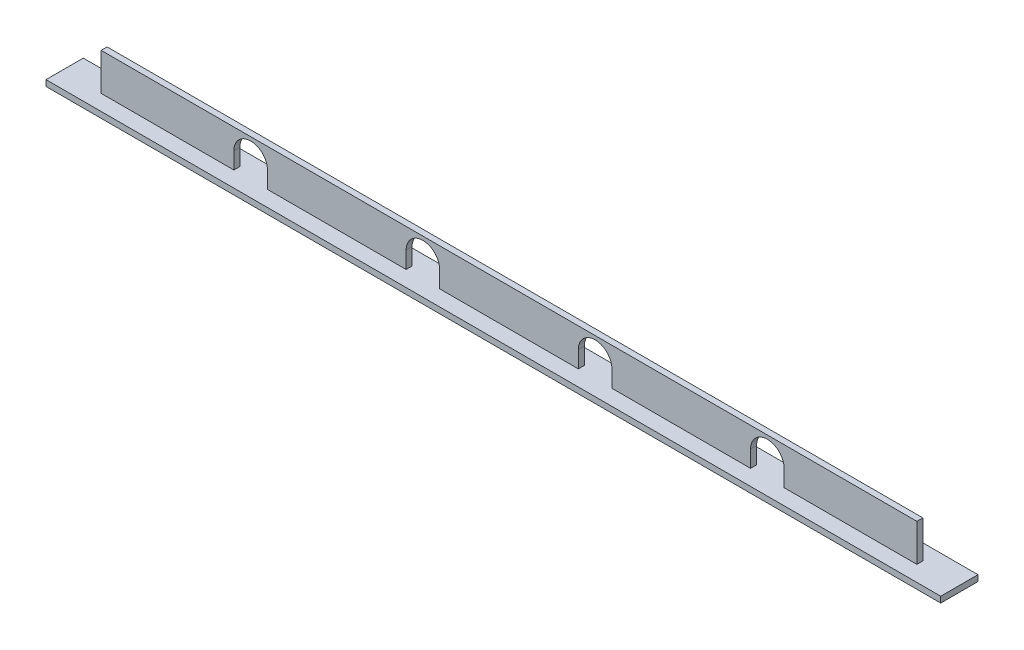
ISO-10303-21;
HEADER;
FILE_DESCRIPTION(('STEP AP214'),'2;1');
FILE_NAME('part.step','',(''),(''),'','','');
FILE_SCHEMA(('AUTOMOTIVE_DESIGN { 1 0 10303 214 1 1 1 1 }'));
ENDSEC;
DATA;
#1=APPLICATION_CONTEXT('core data for automotive mechanical design processes');
#2=APPLICATION_PROTOCOL_DEFINITION('international standard','automotive_design',2000,#1);
#3=PRODUCT_CONTEXT('',#1,'mechanical');
#4=PRODUCT('Part','Part','',(#3));
#5=PRODUCT_RELATED_PRODUCT_CATEGORY('part','',(#4));
#6=PRODUCT_DEFINITION_FORMATION('','',#4);
#7=PRODUCT_DEFINITION_CONTEXT('part definition',#1,'design');
#8=PRODUCT_DEFINITION('design','',#6,#7);
#9=PRODUCT_DEFINITION_SHAPE('','',#8);
#10=(LENGTH_UNIT() NAMED_UNIT(*) SI_UNIT(.MILLI.,.METRE.));
#11=(NAMED_UNIT(*) PLANE_ANGLE_UNIT() SI_UNIT($,.RADIAN.));
#12=(NAMED_UNIT(*) SI_UNIT($,.STERADIAN.) SOLID_ANGLE_UNIT());
#13=UNCERTAINTY_MEASURE_WITH_UNIT(LENGTH_MEASURE(1.E-05),#10,'distance_accuracy_value','');
#14=(GEOMETRIC_REPRESENTATION_CONTEXT(3) GLOBAL_UNCERTAINTY_ASSIGNED_CONTEXT((#13)) GLOBAL_UNIT_ASSIGNED_CONTEXT((#10,
#11,#12)) REPRESENTATION_CONTEXT('',''));
#15=CARTESIAN_POINT('',(0.,0.,0.));
#16=DIRECTION('',(0.,0.,1.));
#17=DIRECTION('',(1.,0.,0.));
#18=AXIS2_PLACEMENT_3D('',#15,#16,#17);
#19=CARTESIAN_POINT('',(600.,-33.,-24.9999999999999));
#20=DIRECTION('',(-1.,0.,0.));
#21=DIRECTION('',(0.,0.,1.));
#22=AXIS2_PLACEMENT_3D('',#19,#20,#21);
#23=PLANE('',#22);
#24=DIRECTION('',(0.,0.,1.));
#25=VECTOR('',#24,1.);
#26=CARTESIAN_POINT('',(600.,-25.,-24.9999999999999));
#27=LINE('',#26,#25);
#28=CARTESIAN_POINT('',(600.,-25.,-24.9999999999999));
#29=VERTEX_POINT('',#28);
#30=CARTESIAN_POINT('',(600.,-25.,24.9999999999999));
#31=VERTEX_POINT('',#30);
#32=EDGE_CURVE('E111',#29,#31,#27,.T.);
#33=ORIENTED_EDGE('',*,*,#32,.T.);
#34=DIRECTION('',(0.,1.,0.));
#35=VECTOR('',#34,1.);
#36=CARTESIAN_POINT('',(600.,-33.,24.9999999999999));
#37=LINE('',#36,#35);
#38=CARTESIAN_POINT('',(600.,-33.,24.9999999999999));
#39=VERTEX_POINT('',#38);
#40=EDGE_CURVE('E13',#39,#31,#37,.T.);
#41=ORIENTED_EDGE('',*,*,#40,.F.);
#42=DIRECTION('',(0.,0.,1.));
#43=VECTOR('',#42,1.);
#44=CARTESIAN_POINT('',(600.,-33.,-24.9999999999999));
#45=LINE('',#44,#43);
#46=CARTESIAN_POINT('',(600.,-33.,-24.9999999999999));
#47=VERTEX_POINT('',#46);
#48=EDGE_CURVE('E99',#47,#39,#45,.T.);
#49=ORIENTED_EDGE('',*,*,#48,.F.);
#50=DIRECTION('',(0.,1.,0.));
#51=VECTOR('',#50,1.);
#52=CARTESIAN_POINT('',(600.,-33.,-24.9999999999999));
#53=LINE('',#52,#51);
#54=EDGE_CURVE('E107',#47,#29,#53,.T.);
#55=ORIENTED_EDGE('',*,*,#54,.T.);
#56=EDGE_LOOP('',(#33,#41,#49,#55));
#57=FACE_BOUND('',#56,.T.);
#58=ADVANCED_FACE('F48',(#57),#23,.F.);
#59=CARTESIAN_POINT('',(-600.,-33.,24.9999999999997));
#60=DIRECTION('',(0.,0.,-1.));
#61=DIRECTION('',(-1.,0.,0.));
#62=AXIS2_PLACEMENT_3D('',#59,#60,#61);
#63=PLANE('',#62);
#64=DIRECTION('',(-1.,0.,0.));
#65=VECTOR('',#64,1.);
#66=CARTESIAN_POINT('',(-600.,-25.,24.9999999999997));
#67=LINE('',#66,#65);
#68=CARTESIAN_POINT('',(-600.,-25.,24.9999999999997));
#69=VERTEX_POINT('',#68);
#70=EDGE_CURVE('E103',#31,#69,#67,.T.);
#71=ORIENTED_EDGE('',*,*,#70,.T.);
#72=DIRECTION('',(0.,1.,0.));
#73=VECTOR('',#72,1.);
#74=CARTESIAN_POINT('',(-600.,-33.,24.9999999999997));
#75=LINE('',#74,#73);
#76=CARTESIAN_POINT('',(-600.,-33.,24.9999999999997));
#77=VERTEX_POINT('',#76);
#78=EDGE_CURVE('E56',#77,#69,#75,.T.);
#79=ORIENTED_EDGE('',*,*,#78,.F.);
#80=DIRECTION('',(-1.,0.,0.));
#81=VECTOR('',#80,1.);
#82=CARTESIAN_POINT('',(-600.,-33.,24.9999999999997));
#83=LINE('',#82,#81);
#84=EDGE_CURVE('E94',#39,#77,#83,.T.);
#85=ORIENTED_EDGE('',*,*,#84,.F.);
#86=ORIENTED_EDGE('',*,*,#40,.T.);
#87=EDGE_LOOP('',(#71,#79,#85,#86));
#88=FACE_BOUND('',#87,.T.);
#89=ADVANCED_FACE('F102',(#88),#63,.F.);
#90=CARTESIAN_POINT('',(-600.,-33.,-25.));
#91=DIRECTION('',(1.,0.,0.));
#92=DIRECTION('',(0.,0.,-1.));
#93=AXIS2_PLACEMENT_3D('',#90,#91,#92);
#94=PLANE('',#93);
#95=DIRECTION('',(0.,0.,-1.));
#96=VECTOR('',#95,1.);
#97=CARTESIAN_POINT('',(-600.,-25.,-25.));
#98=LINE('',#97,#96);
#99=CARTESIAN_POINT('',(-600.,-25.,-25.));
#100=VERTEX_POINT('',#99);
#101=EDGE_CURVE('E81',#69,#100,#98,.T.);
#102=ORIENTED_EDGE('',*,*,#101,.T.);
#103=DIRECTION('',(0.,1.,0.));
#104=VECTOR('',#103,1.);
#105=CARTESIAN_POINT('',(-600.,-33.,-25.));
#106=LINE('',#105,#104);
#107=CARTESIAN_POINT('',(-600.,-33.,-25.));
#108=VERTEX_POINT('',#107);
#109=EDGE_CURVE('E104',#108,#100,#106,.T.);
#110=ORIENTED_EDGE('',*,*,#109,.F.);
#111=DIRECTION('',(0.,0.,-1.));
#112=VECTOR('',#111,1.);
#113=CARTESIAN_POINT('',(-600.,-33.,-25.));
#114=LINE('',#113,#112);
#115=EDGE_CURVE('E97',#77,#108,#114,.T.);
#116=ORIENTED_EDGE('',*,*,#115,.F.);
#117=ORIENTED_EDGE('',*,*,#78,.T.);
#118=EDGE_LOOP('',(#102,#110,#116,#117));
#119=FACE_BOUND('',#118,.T.);
#120=ADVANCED_FACE('F105',(#119),#94,.F.);
#121=CARTESIAN_POINT('',(-600.,-33.,-25.));
#122=DIRECTION('',(0.,0.,1.));
#123=DIRECTION('',(1.,0.,0.));
#124=AXIS2_PLACEMENT_3D('',#121,#122,#123);
#125=PLANE('',#124);
#126=DIRECTION('',(1.,0.,0.));
#127=VECTOR('',#126,1.);
#128=CARTESIAN_POINT('',(-600.,-25.,-25.));
#129=LINE('',#128,#127);
#130=EDGE_CURVE('E87',#100,#29,#129,.T.);
#131=ORIENTED_EDGE('',*,*,#130,.T.);
#132=ORIENTED_EDGE('',*,*,#54,.F.);
#133=DIRECTION('',(1.,0.,0.));
#134=VECTOR('',#133,1.);
#135=CARTESIAN_POINT('',(-600.,-33.,-25.));
#136=LINE('',#135,#134);
#137=EDGE_CURVE('E64',#108,#47,#136,.T.);
#138=ORIENTED_EDGE('',*,*,#137,.F.);
#139=ORIENTED_EDGE('',*,*,#109,.T.);
#140=EDGE_LOOP('',(#131,#132,#138,#139));
#141=FACE_BOUND('',#140,.T.);
#142=ADVANCED_FACE('F118',(#141),#125,.F.);
#143=CARTESIAN_POINT('',(0.,-33.,0.));
#144=DIRECTION('',(0.,1.,0.));
#145=DIRECTION('',(0.,0.,1.));
#146=AXIS2_PLACEMENT_3D('',#143,#144,#145);
#147=PLANE('',#146);
#148=ORIENTED_EDGE('',*,*,#48,.T.);
#149=ORIENTED_EDGE('',*,*,#84,.T.);
#150=ORIENTED_EDGE('',*,*,#115,.T.);
#151=ORIENTED_EDGE('',*,*,#137,.T.);
#152=EDGE_LOOP('',(#148,#149,#150,#151));
#153=FACE_BOUND('',#152,.T.);
#154=ADVANCED_FACE('F95',(#153),#147,.F.);
#155=CARTESIAN_POINT('',(0.,-25.,0.));
#156=DIRECTION('',(0.,1.,0.));
#157=DIRECTION('',(0.,0.,1.));
#158=AXIS2_PLACEMENT_3D('',#155,#156,#157);
#159=PLANE('',#158);
#160=ORIENTED_EDGE('',*,*,#32,.F.);
#161=ORIENTED_EDGE('',*,*,#130,.F.);
#162=ORIENTED_EDGE('',*,*,#101,.F.);
#163=ORIENTED_EDGE('',*,*,#70,.F.);
#164=EDGE_LOOP('',(#160,#161,#162,#163));
#165=FACE_BOUND('',#164,.T.);
#166=ADVANCED_FACE('F121',(#165),#159,.T.);
#167=CLOSED_SHELL('',(#58,#89,#120,#142,#154,#166));
#168=MANIFOLD_SOLID_BREP('B2',#167);
#169=CARTESIAN_POINT('',(-605.,24.9999999999997,4.));
#170=DIRECTION('',(0.,-1.,0.));
#171=DIRECTION('',(1.,0.,0.));
#172=AXIS2_PLACEMENT_3D('',#169,#170,#171);
#173=PLANE('',#172);
#174=DIRECTION('',(0.,0.,-1.));
#175=VECTOR('',#174,1.);
#176=CARTESIAN_POINT('',(547.,24.9999999999998,3.99999999999993));
#177=LINE('',#176,#175);
#178=CARTESIAN_POINT('',(547.,24.9999999999998,3.99999999999993));
#179=VERTEX_POINT('',#178);
#180=CARTESIAN_POINT('',(547.,24.9999999999998,-4.00000000000021));
#181=VERTEX_POINT('',#180);
#182=EDGE_CURVE('E484',#179,#181,#177,.T.);
#183=ORIENTED_EDGE('',*,*,#182,.T.);
#184=DIRECTION('',(-1.,0.,0.));
#185=VECTOR('',#184,1.);
#186=CARTESIAN_POINT('',(-605.,24.9999999999997,-4.));
#187=LINE('',#186,#185);
#188=CARTESIAN_POINT('',(-547.,24.9999999999997,-4.));
#189=VERTEX_POINT('',#188);
#190=EDGE_CURVE('E367',#181,#189,#187,.T.);
#191=ORIENTED_EDGE('',*,*,#190,.T.);
#192=DIRECTION('',(0.,0.,1.));
#193=VECTOR('',#192,1.);
#194=CARTESIAN_POINT('',(-547.,24.9999999999997,-4.00000000000021));
#195=LINE('',#194,#193);
#196=CARTESIAN_POINT('',(-547.,24.9999999999997,3.99999999999999));
#197=VERTEX_POINT('',#196);
#198=EDGE_CURVE('E186',#189,#197,#195,.T.);
#199=ORIENTED_EDGE('',*,*,#198,.T.);
#200=DIRECTION('',(-1.,0.,0.));
#201=VECTOR('',#200,1.);
#202=CARTESIAN_POINT('',(-605.,24.9999999999997,4.));
#203=LINE('',#202,#201);
#204=EDGE_CURVE('E324',#179,#197,#203,.T.);
#205=ORIENTED_EDGE('',*,*,#204,.F.);
#206=EDGE_LOOP('',(#183,#191,#199,#205));
#207=FACE_BOUND('',#206,.T.);
#208=ADVANCED_FACE('F172',(#207),#173,.F.);
#209=CARTESIAN_POINT('',(-555.,-25.,4.));
#210=DIRECTION('',(0.,1.,0.));
#211=DIRECTION('',(0.,0.,1.));
#212=AXIS2_PLACEMENT_3D('',#209,#210,#211);
#213=PLANE('',#212);
#214=DIRECTION('',(0.,0.,1.));
#215=VECTOR('',#214,1.);
#216=CARTESIAN_POINT('',(-547.,-25.0000000000001,-4.00000000000021));
#217=LINE('',#216,#215);
#218=CARTESIAN_POINT('',(-547.,-25.0000000000001,-4.00000000000021));
#219=VERTEX_POINT('',#218);
#220=CARTESIAN_POINT('',(-547.,-25.0000000000001,3.99999999999999));
#221=VERTEX_POINT('',#220);
#222=EDGE_CURVE('E306',#219,#221,#217,.T.);
#223=ORIENTED_EDGE('',*,*,#222,.F.);
#224=DIRECTION('',(1.,0.,0.));
#225=VECTOR('',#224,1.);
#226=CARTESIAN_POINT('',(-555.,-25.,-4.));
#227=LINE('',#226,#225);
#228=CARTESIAN_POINT('',(-369.,-25.,-4.));
#229=VERTEX_POINT('',#228);
#230=EDGE_CURVE('E370',#219,#229,#227,.T.);
#231=ORIENTED_EDGE('',*,*,#230,.T.);
#232=DIRECTION('',(0.,0.,-1.));
#233=VECTOR('',#232,1.);
#234=CARTESIAN_POINT('',(-369.,-25.,4.));
#235=LINE('',#234,#233);
#236=CARTESIAN_POINT('',(-369.,-25.,4.));
#237=VERTEX_POINT('',#236);
#238=EDGE_CURVE('E46',#237,#229,#235,.T.);
#239=ORIENTED_EDGE('',*,*,#238,.F.);
#240=DIRECTION('',(1.,0.,0.));
#241=VECTOR('',#240,1.);
#242=CARTESIAN_POINT('',(-555.,-25.,4.));
#243=LINE('',#242,#241);
#244=EDGE_CURVE('E320',#221,#237,#243,.T.);
#245=ORIENTED_EDGE('',*,*,#244,.F.);
#246=EDGE_LOOP('',(#223,#231,#239,#245));
#247=FACE_BOUND('',#246,.T.);
#248=ADVANCED_FACE('F327',(#247),#213,.F.);
#249=CARTESIAN_POINT('',(369.,-25.,4.));
#250=DIRECTION('',(0.,1.,0.));
#251=DIRECTION('',(0.,0.,1.));
#252=AXIS2_PLACEMENT_3D('',#249,#250,#251);
#253=PLANE('',#252);
#254=DIRECTION('',(0.,0.,-1.));
#255=VECTOR('',#254,1.);
#256=CARTESIAN_POINT('',(547.,-25.,3.99999999999993));
#257=LINE('',#256,#255);
#258=CARTESIAN_POINT('',(547.,-25.,3.99999999999993));
#259=VERTEX_POINT('',#258);
#260=CARTESIAN_POINT('',(547.,-25.,-4.));
#261=VERTEX_POINT('',#260);
#262=EDGE_CURVE('E194',#259,#261,#257,.T.);
#263=ORIENTED_EDGE('',*,*,#262,.F.);
#264=DIRECTION('',(1.,0.,0.));
#265=VECTOR('',#264,1.);
#266=CARTESIAN_POINT('',(369.,-25.,4.));
#267=LINE('',#266,#265);
#268=CARTESIAN_POINT('',(369.,-25.,4.));
#269=VERTEX_POINT('',#268);
#270=EDGE_CURVE('E364',#269,#259,#267,.T.);
#271=ORIENTED_EDGE('',*,*,#270,.F.);
#272=DIRECTION('',(0.,0.,-1.));
#273=VECTOR('',#272,1.);
#274=CARTESIAN_POINT('',(369.,-25.,4.));
#275=LINE('',#274,#273);
#276=CARTESIAN_POINT('',(369.,-25.,-4.));
#277=VERTEX_POINT('',#276);
#278=EDGE_CURVE('E366',#269,#277,#275,.T.);
#279=ORIENTED_EDGE('',*,*,#278,.T.);
#280=DIRECTION('',(1.,0.,0.));
#281=VECTOR('',#280,1.);
#282=CARTESIAN_POINT('',(369.,-25.,-4.));
#283=LINE('',#282,#281);
#284=EDGE_CURVE('E333',#277,#261,#283,.T.);
#285=ORIENTED_EDGE('',*,*,#284,.T.);
#286=EDGE_LOOP('',(#263,#271,#279,#285));
#287=FACE_BOUND('',#286,.T.);
#288=ADVANCED_FACE('F482',(#287),#253,.F.);
#289=CARTESIAN_POINT('',(-577.5,-2.49999999999998,4.));
#290=DIRECTION('',(0.,0.,1.));
#291=DIRECTION('',(1.,0.,0.));
#292=AXIS2_PLACEMENT_3D('',#289,#290,#291);
#293=PLANE('',#292);
#294=ORIENTED_EDGE('',*,*,#270,.T.);
#295=DIRECTION('',(0.,1.,0.));
#296=VECTOR('',#295,1.);
#297=CARTESIAN_POINT('',(547.,-25.,3.99999999999993));
#298=LINE('',#297,#296);
#299=EDGE_CURVE('E325',#259,#179,#298,.T.);
#300=ORIENTED_EDGE('',*,*,#299,.T.);
#301=ORIENTED_EDGE('',*,*,#204,.T.);
#302=DIRECTION('',(0.,1.,0.));
#303=VECTOR('',#302,1.);
#304=CARTESIAN_POINT('',(-547.,-25.0000000000001,3.99999999999999));
#305=LINE('',#304,#303);
#306=EDGE_CURVE('E309',#221,#197,#305,.T.);
#307=ORIENTED_EDGE('',*,*,#306,.F.);
#308=ORIENTED_EDGE('',*,*,#244,.T.);
#309=DIRECTION('',(0.,1.,0.));
#310=VECTOR('',#309,1.);
#311=CARTESIAN_POINT('',(-369.,-2.49999999999998,4.));
#312=LINE('',#311,#310);
#313=CARTESIAN_POINT('',(-369.,-2.49999999999998,4.));
#314=VERTEX_POINT('',#313);
#315=EDGE_CURVE('E329',#237,#314,#312,.T.);
#316=ORIENTED_EDGE('',*,*,#315,.T.);
#317=CARTESIAN_POINT('',(-346.5,-2.49999999999998,4.));
#318=DIRECTION('',(0.,0.,-1.));
#319=DIRECTION('',(1.,0.,0.));
#320=AXIS2_PLACEMENT_3D('',#317,#318,#319);
#321=CIRCLE('',#320,22.5);
#322=CARTESIAN_POINT('',(-324.,-2.49999999999998,4.));
#323=VERTEX_POINT('',#322);
#324=EDGE_CURVE('E331',#314,#323,#321,.T.);
#325=ORIENTED_EDGE('',*,*,#324,.T.);
#326=DIRECTION('',(0.,-1.,0.));
#327=VECTOR('',#326,1.);
#328=CARTESIAN_POINT('',(-324.,-2.49999999999998,4.));
#329=LINE('',#328,#327);
#330=CARTESIAN_POINT('',(-324.,-25.,4.));
#331=VERTEX_POINT('',#330);
#332=EDGE_CURVE('E338',#323,#331,#329,.T.);
#333=ORIENTED_EDGE('',*,*,#332,.T.);
#334=DIRECTION('',(1.,0.,0.));
#335=VECTOR('',#334,1.);
#336=CARTESIAN_POINT('',(-324.,-25.,4.));
#337=LINE('',#336,#335);
#338=CARTESIAN_POINT('',(-138.,-25.,4.));
#339=VERTEX_POINT('',#338);
#340=EDGE_CURVE('E340',#331,#339,#337,.T.);
#341=ORIENTED_EDGE('',*,*,#340,.T.);
#342=DIRECTION('',(0.,1.,0.));
#343=VECTOR('',#342,1.);
#344=CARTESIAN_POINT('',(-138.,-2.49999999999998,4.));
#345=LINE('',#344,#343);
#346=CARTESIAN_POINT('',(-138.,-2.49999999999998,4.));
#347=VERTEX_POINT('',#346);
#348=EDGE_CURVE('E342',#339,#347,#345,.T.);
#349=ORIENTED_EDGE('',*,*,#348,.T.);
#350=CARTESIAN_POINT('',(-115.5,-2.49999999999998,4.));
#351=DIRECTION('',(0.,0.,-1.));
#352=DIRECTION('',(1.,0.,0.));
#353=AXIS2_PLACEMENT_3D('',#350,#351,#352);
#354=CIRCLE('',#353,22.5);
#355=CARTESIAN_POINT('',(-92.9999999999999,-2.49999999999998,4.));
#356=VERTEX_POINT('',#355);
#357=EDGE_CURVE('E344',#347,#356,#354,.T.);
#358=ORIENTED_EDGE('',*,*,#357,.T.);
#359=DIRECTION('',(0.,-1.,0.));
#360=VECTOR('',#359,1.);
#361=CARTESIAN_POINT('',(-93.,-2.49999999999998,4.));
#362=LINE('',#361,#360);
#363=CARTESIAN_POINT('',(-93.,-25.,4.));
#364=VERTEX_POINT('',#363);
#365=EDGE_CURVE('E346',#356,#364,#362,.T.);
#366=ORIENTED_EDGE('',*,*,#365,.T.);
#367=DIRECTION('',(1.,0.,0.));
#368=VECTOR('',#367,1.);
#369=CARTESIAN_POINT('',(-93.,-25.,4.));
#370=LINE('',#369,#368);
#371=CARTESIAN_POINT('',(93.,-25.,4.));
#372=VERTEX_POINT('',#371);
#373=EDGE_CURVE('E348',#364,#372,#370,.T.);
#374=ORIENTED_EDGE('',*,*,#373,.T.);
#375=DIRECTION('',(0.,1.,0.));
#376=VECTOR('',#375,1.);
#377=CARTESIAN_POINT('',(93.,-2.49999999999998,4.));
#378=LINE('',#377,#376);
#379=CARTESIAN_POINT('',(93.,-2.49999999999998,4.));
#380=VERTEX_POINT('',#379);
#381=EDGE_CURVE('E350',#372,#380,#378,.T.);
#382=ORIENTED_EDGE('',*,*,#381,.T.);
#383=CARTESIAN_POINT('',(115.5,-2.49999999999998,4.));
#384=DIRECTION('',(0.,0.,-1.));
#385=DIRECTION('',(1.,0.,0.));
#386=AXIS2_PLACEMENT_3D('',#383,#384,#385);
#387=CIRCLE('',#386,22.5);
#388=CARTESIAN_POINT('',(138.,-2.49999999999998,4.));
#389=VERTEX_POINT('',#388);
#390=EDGE_CURVE('E352',#380,#389,#387,.T.);
#391=ORIENTED_EDGE('',*,*,#390,.T.);
#392=DIRECTION('',(0.,-1.,0.));
#393=VECTOR('',#392,1.);
#394=CARTESIAN_POINT('',(138.,-2.49999999999998,4.));
#395=LINE('',#394,#393);
#396=CARTESIAN_POINT('',(138.,-25.,4.));
#397=VERTEX_POINT('',#396);
#398=EDGE_CURVE('E354',#389,#397,#395,.T.);
#399=ORIENTED_EDGE('',*,*,#398,.T.);
#400=DIRECTION('',(1.,0.,0.));
#401=VECTOR('',#400,1.);
#402=CARTESIAN_POINT('',(138.,-25.,4.));
#403=LINE('',#402,#401);
#404=CARTESIAN_POINT('',(324.,-25.,4.));
#405=VERTEX_POINT('',#404);
#406=EDGE_CURVE('E356',#397,#405,#403,.T.);
#407=ORIENTED_EDGE('',*,*,#406,.T.);
#408=DIRECTION('',(0.,1.,0.));
#409=VECTOR('',#408,1.);
#410=CARTESIAN_POINT('',(324.,-2.49999999999998,4.));
#411=LINE('',#410,#409);
#412=CARTESIAN_POINT('',(324.,-2.49999999999998,4.));
#413=VERTEX_POINT('',#412);
#414=EDGE_CURVE('E358',#405,#413,#411,.T.);
#415=ORIENTED_EDGE('',*,*,#414,.T.);
#416=CARTESIAN_POINT('',(346.5,-2.49999999999998,4.));
#417=DIRECTION('',(0.,0.,-1.));
#418=DIRECTION('',(1.,0.,0.));
#419=AXIS2_PLACEMENT_3D('',#416,#417,#418);
#420=CIRCLE('',#419,22.5);
#421=CARTESIAN_POINT('',(369.,-2.49999999999998,4.));
#422=VERTEX_POINT('',#421);
#423=EDGE_CURVE('E360',#413,#422,#420,.T.);
#424=ORIENTED_EDGE('',*,*,#423,.T.);
#425=DIRECTION('',(0.,-1.,0.));
#426=VECTOR('',#425,1.);
#427=CARTESIAN_POINT('',(369.,-2.49999999999998,4.));
#428=LINE('',#427,#426);
#429=EDGE_CURVE('E362',#422,#269,#428,.T.);
#430=ORIENTED_EDGE('',*,*,#429,.T.);
#431=EDGE_LOOP('',(#294,#300,#301,#307,#308,#316,#325,#333,#341,#349,#358,#366,#374,#382,#391,
#399,#407,#415,#424,#430));
#432=FACE_BOUND('',#431,.T.);
#433=ADVANCED_FACE('F319',(#432),#293,.T.);
#434=CARTESIAN_POINT('',(-577.5,-2.49999999999998,-4.));
#435=DIRECTION('',(0.,0.,1.));
#436=DIRECTION('',(1.,0.,0.));
#437=AXIS2_PLACEMENT_3D('',#434,#435,#436);
#438=PLANE('',#437);
#439=DIRECTION('',(0.,1.,0.));
#440=VECTOR('',#439,1.);
#441=CARTESIAN_POINT('',(547.,-25.,-4.00000000000021));
#442=LINE('',#441,#440);
#443=EDGE_CURVE('E314',#261,#181,#442,.T.);
#444=ORIENTED_EDGE('',*,*,#443,.F.);
#445=ORIENTED_EDGE('',*,*,#284,.F.);
#446=DIRECTION('',(0.,-1.,0.));
#447=VECTOR('',#446,1.);
#448=CARTESIAN_POINT('',(369.,-2.49999999999998,-4.));
#449=LINE('',#448,#447);
#450=CARTESIAN_POINT('',(369.,-2.49999999999998,-4.));
#451=VERTEX_POINT('',#450);
#452=EDGE_CURVE('E400',#451,#277,#449,.T.);
#453=ORIENTED_EDGE('',*,*,#452,.F.);
#454=CARTESIAN_POINT('',(346.5,-2.49999999999998,-4.));
#455=DIRECTION('',(0.,0.,-1.));
#456=DIRECTION('',(1.,0.,0.));
#457=AXIS2_PLACEMENT_3D('',#454,#455,#456);
#458=CIRCLE('',#457,22.5);
#459=CARTESIAN_POINT('',(324.,-2.49999999999998,-4.));
#460=VERTEX_POINT('',#459);
#461=EDGE_CURVE('E398',#460,#451,#458,.T.);
#462=ORIENTED_EDGE('',*,*,#461,.F.);
#463=DIRECTION('',(0.,1.,0.));
#464=VECTOR('',#463,1.);
#465=CARTESIAN_POINT('',(324.,-2.49999999999998,-4.));
#466=LINE('',#465,#464);
#467=CARTESIAN_POINT('',(324.,-25.,-4.));
#468=VERTEX_POINT('',#467);
#469=EDGE_CURVE('E396',#468,#460,#466,.T.);
#470=ORIENTED_EDGE('',*,*,#469,.F.);
#471=DIRECTION('',(1.,0.,0.));
#472=VECTOR('',#471,1.);
#473=CARTESIAN_POINT('',(138.,-25.,-4.));
#474=LINE('',#473,#472);
#475=CARTESIAN_POINT('',(138.,-25.,-4.));
#476=VERTEX_POINT('',#475);
#477=EDGE_CURVE('E394',#476,#468,#474,.T.);
#478=ORIENTED_EDGE('',*,*,#477,.F.);
#479=DIRECTION('',(0.,-1.,0.));
#480=VECTOR('',#479,1.);
#481=CARTESIAN_POINT('',(138.,-2.49999999999998,-4.));
#482=LINE('',#481,#480);
#483=CARTESIAN_POINT('',(138.,-2.49999999999998,-4.));
#484=VERTEX_POINT('',#483);
#485=EDGE_CURVE('E392',#484,#476,#482,.T.);
#486=ORIENTED_EDGE('',*,*,#485,.F.);
#487=CARTESIAN_POINT('',(115.5,-2.49999999999998,-4.));
#488=DIRECTION('',(0.,0.,-1.));
#489=DIRECTION('',(1.,0.,0.));
#490=AXIS2_PLACEMENT_3D('',#487,#488,#489);
#491=CIRCLE('',#490,22.5);
#492=CARTESIAN_POINT('',(93.,-2.49999999999998,-4.));
#493=VERTEX_POINT('',#492);
#494=EDGE_CURVE('E390',#493,#484,#491,.T.);
#495=ORIENTED_EDGE('',*,*,#494,.F.);
#496=DIRECTION('',(0.,1.,0.));
#497=VECTOR('',#496,1.);
#498=CARTESIAN_POINT('',(93.,-2.49999999999998,-4.));
#499=LINE('',#498,#497);
#500=CARTESIAN_POINT('',(93.,-25.,-4.));
#501=VERTEX_POINT('',#500);
#502=EDGE_CURVE('E388',#501,#493,#499,.T.);
#503=ORIENTED_EDGE('',*,*,#502,.F.);
#504=DIRECTION('',(1.,0.,0.));
#505=VECTOR('',#504,1.);
#506=CARTESIAN_POINT('',(-93.,-25.,-4.));
#507=LINE('',#506,#505);
#508=CARTESIAN_POINT('',(-93.,-25.,-4.));
#509=VERTEX_POINT('',#508);
#510=EDGE_CURVE('E386',#509,#501,#507,.T.);
#511=ORIENTED_EDGE('',*,*,#510,.F.);
#512=DIRECTION('',(0.,-1.,0.));
#513=VECTOR('',#512,1.);
#514=CARTESIAN_POINT('',(-93.,-2.49999999999998,-4.));
#515=LINE('',#514,#513);
#516=CARTESIAN_POINT('',(-92.9999999999999,-2.49999999999998,-4.));
#517=VERTEX_POINT('',#516);
#518=EDGE_CURVE('E384',#517,#509,#515,.T.);
#519=ORIENTED_EDGE('',*,*,#518,.F.);
#520=CARTESIAN_POINT('',(-115.5,-2.49999999999998,-4.));
#521=DIRECTION('',(0.,0.,-1.));
#522=DIRECTION('',(1.,0.,0.));
#523=AXIS2_PLACEMENT_3D('',#520,#521,#522);
#524=CIRCLE('',#523,22.5);
#525=CARTESIAN_POINT('',(-138.,-2.49999999999998,-4.));
#526=VERTEX_POINT('',#525);
#527=EDGE_CURVE('E382',#526,#517,#524,.T.);
#528=ORIENTED_EDGE('',*,*,#527,.F.);
#529=DIRECTION('',(0.,1.,0.));
#530=VECTOR('',#529,1.);
#531=CARTESIAN_POINT('',(-138.,-2.49999999999998,-4.));
#532=LINE('',#531,#530);
#533=CARTESIAN_POINT('',(-138.,-25.,-4.));
#534=VERTEX_POINT('',#533);
#535=EDGE_CURVE('E380',#534,#526,#532,.T.);
#536=ORIENTED_EDGE('',*,*,#535,.F.);
#537=DIRECTION('',(1.,0.,0.));
#538=VECTOR('',#537,1.);
#539=CARTESIAN_POINT('',(-324.,-25.,-4.));
#540=LINE('',#539,#538);
#541=CARTESIAN_POINT('',(-324.,-25.,-4.));
#542=VERTEX_POINT('',#541);
#543=EDGE_CURVE('E378',#542,#534,#540,.T.);
#544=ORIENTED_EDGE('',*,*,#543,.F.);
#545=DIRECTION('',(0.,-1.,0.));
#546=VECTOR('',#545,1.);
#547=CARTESIAN_POINT('',(-324.,-2.49999999999998,-4.));
#548=LINE('',#547,#546);
#549=CARTESIAN_POINT('',(-324.,-2.49999999999998,-4.));
#550=VERTEX_POINT('',#549);
#551=EDGE_CURVE('E376',#550,#542,#548,.T.);
#552=ORIENTED_EDGE('',*,*,#551,.F.);
#553=CARTESIAN_POINT('',(-346.5,-2.49999999999998,-4.));
#554=DIRECTION('',(0.,0.,-1.));
#555=DIRECTION('',(1.,0.,0.));
#556=AXIS2_PLACEMENT_3D('',#553,#554,#555);
#557=CIRCLE('',#556,22.5);
#558=CARTESIAN_POINT('',(-369.,-2.49999999999998,-4.));
#559=VERTEX_POINT('',#558);
#560=EDGE_CURVE('E374',#559,#550,#557,.T.);
#561=ORIENTED_EDGE('',*,*,#560,.F.);
#562=DIRECTION('',(0.,1.,0.));
#563=VECTOR('',#562,1.);
#564=CARTESIAN_POINT('',(-369.,-2.49999999999998,-4.));
#565=LINE('',#564,#563);
#566=EDGE_CURVE('E372',#229,#559,#565,.T.);
#567=ORIENTED_EDGE('',*,*,#566,.F.);
#568=ORIENTED_EDGE('',*,*,#230,.F.);
#569=DIRECTION('',(0.,1.,0.));
#570=VECTOR('',#569,1.);
#571=CARTESIAN_POINT('',(-547.,-25.0000000000001,-4.00000000000021));
#572=LINE('',#571,#570);
#573=EDGE_CURVE('E310',#219,#189,#572,.T.);
#574=ORIENTED_EDGE('',*,*,#573,.T.);
#575=ORIENTED_EDGE('',*,*,#190,.F.);
#576=EDGE_LOOP('',(#444,#445,#453,#462,#470,#478,#486,#495,#503,#511,#519,#528,#536,#544,#552,
#561,#567,#568,#574,#575));
#577=FACE_BOUND('',#576,.T.);
#578=ADVANCED_FACE('F455',(#577),#438,.F.);
#579=CARTESIAN_POINT('',(-369.,-2.49999999999998,4.));
#580=DIRECTION('',(-1.,0.,0.));
#581=DIRECTION('',(0.,0.,1.));
#582=AXIS2_PLACEMENT_3D('',#579,#580,#581);
#583=PLANE('',#582);
#584=ORIENTED_EDGE('',*,*,#566,.T.);
#585=DIRECTION('',(0.,0.,-1.));
#586=VECTOR('',#585,1.);
#587=CARTESIAN_POINT('',(-369.,-2.49999999999998,4.));
#588=LINE('',#587,#586);
#589=EDGE_CURVE('E179',#314,#559,#588,.T.);
#590=ORIENTED_EDGE('',*,*,#589,.F.);
#591=ORIENTED_EDGE('',*,*,#315,.F.);
#592=ORIENTED_EDGE('',*,*,#238,.T.);
#593=EDGE_LOOP('',(#584,#590,#591,#592));
#594=FACE_BOUND('',#593,.T.);
#595=ADVANCED_FACE('F468',(#594),#583,.F.);
#596=CARTESIAN_POINT('',(-346.5,-2.49999999999998,4.));
#597=DIRECTION('',(0.,0.,-1.));
#598=DIRECTION('',(-1.,0.,0.));
#599=AXIS2_PLACEMENT_3D('',#596,#597,#598);
#600=CYLINDRICAL_SURFACE('',#599,22.5);
#601=ORIENTED_EDGE('',*,*,#560,.T.);
#602=DIRECTION('',(0.,0.,-1.));
#603=VECTOR('',#602,1.);
#604=CARTESIAN_POINT('',(-324.,-2.49999999999998,4.));
#605=LINE('',#604,#603);
#606=EDGE_CURVE('E442',#323,#550,#605,.T.);
#607=ORIENTED_EDGE('',*,*,#606,.F.);
#608=ORIENTED_EDGE('',*,*,#324,.F.);
#609=ORIENTED_EDGE('',*,*,#589,.T.);
#610=EDGE_LOOP('',(#601,#607,#608,#609));
#611=FACE_BOUND('',#610,.T.);
#612=ADVANCED_FACE('F449',(#611),#600,.F.);
#613=CARTESIAN_POINT('',(-324.,-2.49999999999998,4.));
#614=DIRECTION('',(1.,0.,0.));
#615=DIRECTION('',(0.,0.,-1.));
#616=AXIS2_PLACEMENT_3D('',#613,#614,#615);
#617=PLANE('',#616);
#618=ORIENTED_EDGE('',*,*,#551,.T.);
#619=DIRECTION('',(0.,0.,-1.));
#620=VECTOR('',#619,1.);
#621=CARTESIAN_POINT('',(-324.,-25.,4.));
#622=LINE('',#621,#620);
#623=EDGE_CURVE('E439',#331,#542,#622,.T.);
#624=ORIENTED_EDGE('',*,*,#623,.F.);
#625=ORIENTED_EDGE('',*,*,#332,.F.);
#626=ORIENTED_EDGE('',*,*,#606,.T.);
#627=EDGE_LOOP('',(#618,#624,#625,#626));
#628=FACE_BOUND('',#627,.T.);
#629=ADVANCED_FACE('F460',(#628),#617,.F.);
#630=CARTESIAN_POINT('',(-324.,-25.,4.));
#631=DIRECTION('',(0.,1.,0.));
#632=DIRECTION('',(0.,0.,1.));
#633=AXIS2_PLACEMENT_3D('',#630,#631,#632);
#634=PLANE('',#633);
#635=ORIENTED_EDGE('',*,*,#543,.T.);
#636=DIRECTION('',(0.,0.,-1.));
#637=VECTOR('',#636,1.);
#638=CARTESIAN_POINT('',(-138.,-25.,4.));
#639=LINE('',#638,#637);
#640=EDGE_CURVE('E436',#339,#534,#639,.T.);
#641=ORIENTED_EDGE('',*,*,#640,.F.);
#642=ORIENTED_EDGE('',*,*,#340,.F.);
#643=ORIENTED_EDGE('',*,*,#623,.T.);
#644=EDGE_LOOP('',(#635,#641,#642,#643));
#645=FACE_BOUND('',#644,.T.);
#646=ADVANCED_FACE('F464',(#645),#634,.F.);
#647=CARTESIAN_POINT('',(-138.,-2.49999999999998,4.));
#648=DIRECTION('',(-1.,0.,0.));
#649=DIRECTION('',(0.,0.,1.));
#650=AXIS2_PLACEMENT_3D('',#647,#648,#649);
#651=PLANE('',#650);
#652=ORIENTED_EDGE('',*,*,#535,.T.);
#653=DIRECTION('',(0.,0.,-1.));
#654=VECTOR('',#653,1.);
#655=CARTESIAN_POINT('',(-138.,-2.49999999999998,4.));
#656=LINE('',#655,#654);
#657=EDGE_CURVE('E433',#347,#526,#656,.T.);
#658=ORIENTED_EDGE('',*,*,#657,.F.);
#659=ORIENTED_EDGE('',*,*,#348,.F.);
#660=ORIENTED_EDGE('',*,*,#640,.T.);
#661=EDGE_LOOP('',(#652,#658,#659,#660));
#662=FACE_BOUND('',#661,.T.);
#663=ADVANCED_FACE('F546',(#662),#651,.F.);
#664=CARTESIAN_POINT('',(-115.5,-2.49999999999998,4.));
#665=DIRECTION('',(0.,0.,-1.));
#666=DIRECTION('',(-1.,0.,0.));
#667=AXIS2_PLACEMENT_3D('',#664,#665,#666);
#668=CYLINDRICAL_SURFACE('',#667,22.5);
#669=ORIENTED_EDGE('',*,*,#527,.T.);
#670=DIRECTION('',(0.,0.,-1.));
#671=VECTOR('',#670,1.);
#672=CARTESIAN_POINT('',(-92.9999999999999,-2.49999999999998,4.));
#673=LINE('',#672,#671);
#674=EDGE_CURVE('E430',#356,#517,#673,.T.);
#675=ORIENTED_EDGE('',*,*,#674,.F.);
#676=ORIENTED_EDGE('',*,*,#357,.F.);
#677=ORIENTED_EDGE('',*,*,#657,.T.);
#678=EDGE_LOOP('',(#669,#675,#676,#677));
#679=FACE_BOUND('',#678,.T.);
#680=ADVANCED_FACE('F543',(#679),#668,.F.);
#681=CARTESIAN_POINT('',(-93.,-2.49999999999998,4.));
#682=DIRECTION('',(1.,0.,0.));
#683=DIRECTION('',(0.,0.,-1.));
#684=AXIS2_PLACEMENT_3D('',#681,#682,#683);
#685=PLANE('',#684);
#686=ORIENTED_EDGE('',*,*,#518,.T.);
#687=DIRECTION('',(0.,0.,-1.));
#688=VECTOR('',#687,1.);
#689=CARTESIAN_POINT('',(-93.,-25.,4.));
#690=LINE('',#689,#688);
#691=EDGE_CURVE('E427',#364,#509,#690,.T.);
#692=ORIENTED_EDGE('',*,*,#691,.F.);
#693=ORIENTED_EDGE('',*,*,#365,.F.);
#694=ORIENTED_EDGE('',*,*,#674,.T.);
#695=EDGE_LOOP('',(#686,#692,#693,#694));
#696=FACE_BOUND('',#695,.T.);
#697=ADVANCED_FACE('F539',(#696),#685,.F.);
#698=CARTESIAN_POINT('',(-93.,-25.,4.));
#699=DIRECTION('',(0.,1.,0.));
#700=DIRECTION('',(0.,0.,1.));
#701=AXIS2_PLACEMENT_3D('',#698,#699,#700);
#702=PLANE('',#701);
#703=ORIENTED_EDGE('',*,*,#510,.T.);
#704=DIRECTION('',(0.,0.,-1.));
#705=VECTOR('',#704,1.);
#706=CARTESIAN_POINT('',(93.,-25.,4.));
#707=LINE('',#706,#705);
#708=EDGE_CURVE('E424',#372,#501,#707,.T.);
#709=ORIENTED_EDGE('',*,*,#708,.F.);
#710=ORIENTED_EDGE('',*,*,#373,.F.);
#711=ORIENTED_EDGE('',*,*,#691,.T.);
#712=EDGE_LOOP('',(#703,#709,#710,#711));
#713=FACE_BOUND('',#712,.T.);
#714=ADVANCED_FACE('F535',(#713),#702,.F.);
#715=CARTESIAN_POINT('',(93.,-2.49999999999998,4.));
#716=DIRECTION('',(-1.,0.,0.));
#717=DIRECTION('',(0.,0.,1.));
#718=AXIS2_PLACEMENT_3D('',#715,#716,#717);
#719=PLANE('',#718);
#720=ORIENTED_EDGE('',*,*,#502,.T.);
#721=DIRECTION('',(0.,0.,-1.));
#722=VECTOR('',#721,1.);
#723=CARTESIAN_POINT('',(93.,-2.49999999999998,4.));
#724=LINE('',#723,#722);
#725=EDGE_CURVE('E421',#380,#493,#724,.T.);
#726=ORIENTED_EDGE('',*,*,#725,.F.);
#727=ORIENTED_EDGE('',*,*,#381,.F.);
#728=ORIENTED_EDGE('',*,*,#708,.T.);
#729=EDGE_LOOP('',(#720,#726,#727,#728));
#730=FACE_BOUND('',#729,.T.);
#731=ADVANCED_FACE('F530',(#730),#719,.F.);
#732=CARTESIAN_POINT('',(115.5,-2.49999999999998,4.));
#733=DIRECTION('',(0.,0.,-1.));
#734=DIRECTION('',(-1.,0.,0.));
#735=AXIS2_PLACEMENT_3D('',#732,#733,#734);
#736=CYLINDRICAL_SURFACE('',#735,22.5);
#737=ORIENTED_EDGE('',*,*,#494,.T.);
#738=DIRECTION('',(0.,0.,-1.));
#739=VECTOR('',#738,1.);
#740=CARTESIAN_POINT('',(138.,-2.49999999999998,4.));
#741=LINE('',#740,#739);
#742=EDGE_CURVE('E418',#389,#484,#741,.T.);
#743=ORIENTED_EDGE('',*,*,#742,.F.);
#744=ORIENTED_EDGE('',*,*,#390,.F.);
#745=ORIENTED_EDGE('',*,*,#725,.T.);
#746=EDGE_LOOP('',(#737,#743,#744,#745));
#747=FACE_BOUND('',#746,.T.);
#748=ADVANCED_FACE('F524',(#747),#736,.F.);
#749=CARTESIAN_POINT('',(138.,-2.49999999999998,4.));
#750=DIRECTION('',(1.,0.,0.));
#751=DIRECTION('',(0.,0.,-1.));
#752=AXIS2_PLACEMENT_3D('',#749,#750,#751);
#753=PLANE('',#752);
#754=ORIENTED_EDGE('',*,*,#485,.T.);
#755=DIRECTION('',(0.,0.,-1.));
#756=VECTOR('',#755,1.);
#757=CARTESIAN_POINT('',(138.,-25.,4.));
#758=LINE('',#757,#756);
#759=EDGE_CURVE('E415',#397,#476,#758,.T.);
#760=ORIENTED_EDGE('',*,*,#759,.F.);
#761=ORIENTED_EDGE('',*,*,#398,.F.);
#762=ORIENTED_EDGE('',*,*,#742,.T.);
#763=EDGE_LOOP('',(#754,#760,#761,#762));
#764=FACE_BOUND('',#763,.T.);
#765=ADVANCED_FACE('F520',(#764),#753,.F.);
#766=CARTESIAN_POINT('',(138.,-25.,4.));
#767=DIRECTION('',(0.,1.,0.));
#768=DIRECTION('',(0.,0.,1.));
#769=AXIS2_PLACEMENT_3D('',#766,#767,#768);
#770=PLANE('',#769);
#771=ORIENTED_EDGE('',*,*,#477,.T.);
#772=DIRECTION('',(0.,0.,-1.));
#773=VECTOR('',#772,1.);
#774=CARTESIAN_POINT('',(324.,-25.,4.));
#775=LINE('',#774,#773);
#776=EDGE_CURVE('E412',#405,#468,#775,.T.);
#777=ORIENTED_EDGE('',*,*,#776,.F.);
#778=ORIENTED_EDGE('',*,*,#406,.F.);
#779=ORIENTED_EDGE('',*,*,#759,.T.);
#780=EDGE_LOOP('',(#771,#777,#778,#779));
#781=FACE_BOUND('',#780,.T.);
#782=ADVANCED_FACE('F515',(#781),#770,.F.);
#783=CARTESIAN_POINT('',(324.,-2.49999999999998,4.));
#784=DIRECTION('',(-1.,0.,0.));
#785=DIRECTION('',(0.,0.,1.));
#786=AXIS2_PLACEMENT_3D('',#783,#784,#785);
#787=PLANE('',#786);
#788=ORIENTED_EDGE('',*,*,#469,.T.);
#789=DIRECTION('',(0.,0.,-1.));
#790=VECTOR('',#789,1.);
#791=CARTESIAN_POINT('',(324.,-2.49999999999998,4.));
#792=LINE('',#791,#790);
#793=EDGE_CURVE('E409',#413,#460,#792,.T.);
#794=ORIENTED_EDGE('',*,*,#793,.F.);
#795=ORIENTED_EDGE('',*,*,#414,.F.);
#796=ORIENTED_EDGE('',*,*,#776,.T.);
#797=EDGE_LOOP('',(#788,#794,#795,#796));
#798=FACE_BOUND('',#797,.T.);
#799=ADVANCED_FACE('F509',(#798),#787,.F.);
#800=CARTESIAN_POINT('',(346.5,-2.49999999999998,4.));
#801=DIRECTION('',(0.,0.,-1.));
#802=DIRECTION('',(-1.,0.,0.));
#803=AXIS2_PLACEMENT_3D('',#800,#801,#802);
#804=CYLINDRICAL_SURFACE('',#803,22.5);
#805=ORIENTED_EDGE('',*,*,#461,.T.);
#806=DIRECTION('',(0.,0.,-1.));
#807=VECTOR('',#806,1.);
#808=CARTESIAN_POINT('',(369.,-2.49999999999998,4.));
#809=LINE('',#808,#807);
#810=EDGE_CURVE('E406',#422,#451,#809,.T.);
#811=ORIENTED_EDGE('',*,*,#810,.F.);
#812=ORIENTED_EDGE('',*,*,#423,.F.);
#813=ORIENTED_EDGE('',*,*,#793,.T.);
#814=EDGE_LOOP('',(#805,#811,#812,#813));
#815=FACE_BOUND('',#814,.T.);
#816=ADVANCED_FACE('F505',(#815),#804,.F.);
#817=CARTESIAN_POINT('',(369.,-2.49999999999998,4.));
#818=DIRECTION('',(1.,0.,0.));
#819=DIRECTION('',(0.,0.,-1.));
#820=AXIS2_PLACEMENT_3D('',#817,#818,#819);
#821=PLANE('',#820);
#822=ORIENTED_EDGE('',*,*,#452,.T.);
#823=ORIENTED_EDGE('',*,*,#278,.F.);
#824=ORIENTED_EDGE('',*,*,#429,.F.);
#825=ORIENTED_EDGE('',*,*,#810,.T.);
#826=EDGE_LOOP('',(#822,#823,#824,#825));
#827=FACE_BOUND('',#826,.T.);
#828=ADVANCED_FACE('F500',(#827),#821,.F.);
#829=CARTESIAN_POINT('',(-547.,-25.0000000000001,-4.00000000000021));
#830=DIRECTION('',(-1.,0.,0.));
#831=DIRECTION('',(0.,-1.,0.));
#832=AXIS2_PLACEMENT_3D('',#829,#830,#831);
#833=PLANE('',#832);
#834=ORIENTED_EDGE('',*,*,#198,.F.);
#835=ORIENTED_EDGE('',*,*,#573,.F.);
#836=ORIENTED_EDGE('',*,*,#222,.T.);
#837=ORIENTED_EDGE('',*,*,#306,.T.);
#838=EDGE_LOOP('',(#834,#835,#836,#837));
#839=FACE_BOUND('',#838,.T.);
#840=ADVANCED_FACE('F308',(#839),#833,.T.);
#841=CARTESIAN_POINT('',(547.,-25.,3.99999999999993));
#842=DIRECTION('',(1.,0.,0.));
#843=DIRECTION('',(0.,1.,0.));
#844=AXIS2_PLACEMENT_3D('',#841,#842,#843);
#845=PLANE('',#844);
#846=ORIENTED_EDGE('',*,*,#182,.F.);
#847=ORIENTED_EDGE('',*,*,#299,.F.);
#848=ORIENTED_EDGE('',*,*,#262,.T.);
#849=ORIENTED_EDGE('',*,*,#443,.T.);
#850=EDGE_LOOP('',(#846,#847,#848,#849));
#851=FACE_BOUND('',#850,.T.);
#852=ADVANCED_FACE('F493',(#851),#845,.T.);
#853=CLOSED_SHELL('',(#208,#248,#288,#433,#578,#595,#612,#629,#646,#663,#680,#697,#714,#731,
#748,#765,#782,#799,#816,#828,#840,#852));
#854=MANIFOLD_SOLID_BREP('B7',#853);
#855=ADVANCED_BREP_SHAPE_REPRESENTATION('',(#18,#168,#854),#14);
#856=SHAPE_DEFINITION_REPRESENTATION(#9,#855);
ENDSEC;
END-ISO-10303-21;
